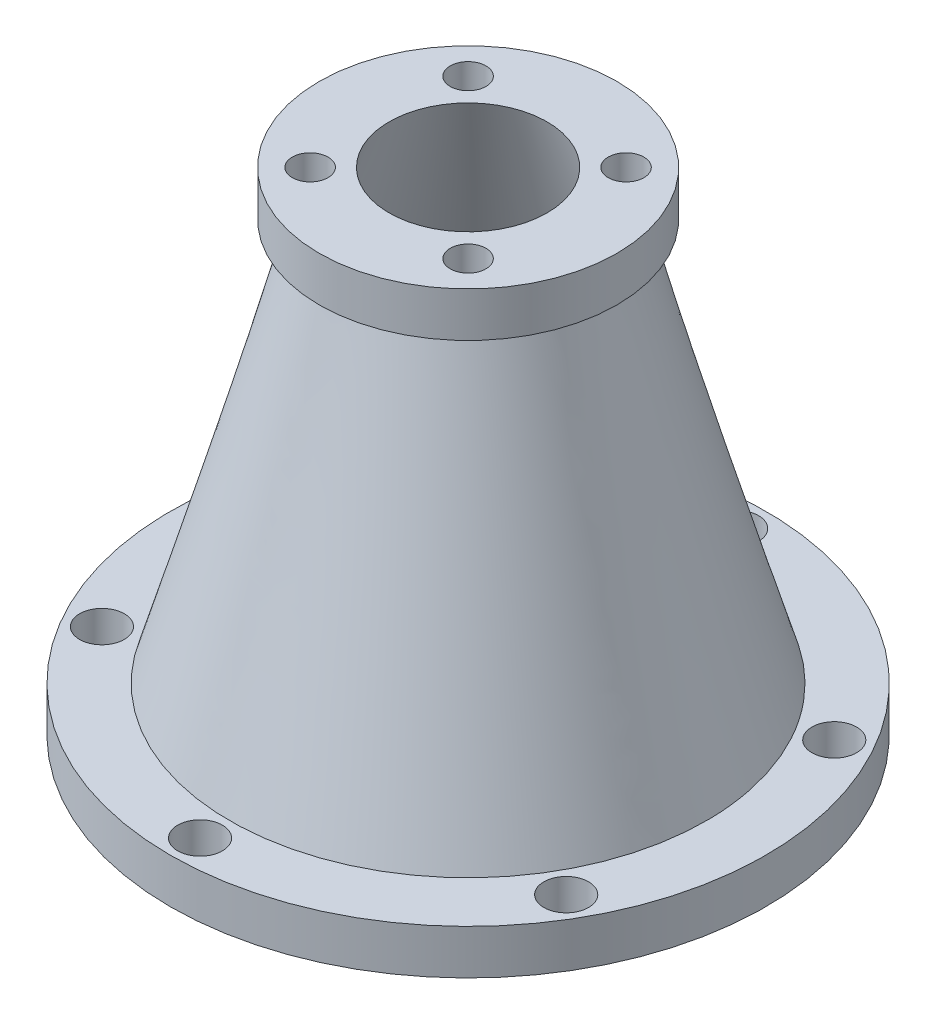
ISO-10303-21;
HEADER;
FILE_DESCRIPTION(('STEP AP214'),'2;1');
FILE_NAME('part.step','',(''),(''),'','','');
FILE_SCHEMA(('AUTOMOTIVE_DESIGN { 1 0 10303 214 1 1 1 1 }'));
ENDSEC;
DATA;
#1=APPLICATION_CONTEXT('core data for automotive mechanical design processes');
#2=APPLICATION_PROTOCOL_DEFINITION('international standard','automotive_design',2000,#1);
#3=PRODUCT_CONTEXT('',#1,'mechanical');
#4=PRODUCT('Part','Part','',(#3));
#5=PRODUCT_RELATED_PRODUCT_CATEGORY('part','',(#4));
#6=PRODUCT_DEFINITION_FORMATION('','',#4);
#7=PRODUCT_DEFINITION_CONTEXT('part definition',#1,'design');
#8=PRODUCT_DEFINITION('design','',#6,#7);
#9=PRODUCT_DEFINITION_SHAPE('','',#8);
#10=(LENGTH_UNIT() NAMED_UNIT(*) SI_UNIT(.MILLI.,.METRE.));
#11=(NAMED_UNIT(*) PLANE_ANGLE_UNIT() SI_UNIT($,.RADIAN.));
#12=(NAMED_UNIT(*) SI_UNIT($,.STERADIAN.) SOLID_ANGLE_UNIT());
#13=UNCERTAINTY_MEASURE_WITH_UNIT(LENGTH_MEASURE(1.E-05),#10,'distance_accuracy_value','');
#14=(GEOMETRIC_REPRESENTATION_CONTEXT(3) GLOBAL_UNCERTAINTY_ASSIGNED_CONTEXT((#13)) GLOBAL_UNIT_ASSIGNED_CONTEXT((#10,
#11,#12)) REPRESENTATION_CONTEXT('',''));
#15=CARTESIAN_POINT('',(0.,0.,0.));
#16=DIRECTION('',(0.,0.,1.));
#17=DIRECTION('',(1.,0.,0.));
#18=AXIS2_PLACEMENT_3D('',#15,#16,#17);
#19=CARTESIAN_POINT('',(0.,30.,0.));
#20=DIRECTION('',(0.,1.,0.));
#21=DIRECTION('',(0.,0.,1.));
#22=AXIS2_PLACEMENT_3D('',#19,#20,#21);
#23=PLANE('',#22);
#24=CARTESIAN_POINT('',(0.,30.,-180.));
#25=DIRECTION('',(0.,1.,0.));
#26=DIRECTION('',(0.,0.,1.));
#27=AXIS2_PLACEMENT_3D('',#24,#25,#26);
#28=CIRCLE('',#27,15.);
#29=CARTESIAN_POINT('',(0.,30.,-165.));
#30=VERTEX_POINT('',#29);
#31=EDGE_CURVE('E72',#30,#30,#28,.T.);
#32=ORIENTED_EDGE('',*,*,#31,.F.);
#33=EDGE_LOOP('',(#32));
#34=FACE_BOUND('',#33,.T.);
#35=CARTESIAN_POINT('',(-155.884572681198,30.,-90.0000000000018));
#36=DIRECTION('',(0.,1.,0.));
#37=DIRECTION('',(0.,0.,1.));
#38=AXIS2_PLACEMENT_3D('',#35,#36,#37);
#39=CIRCLE('',#38,15.);
#40=CARTESIAN_POINT('',(-155.884572681198,30.,-75.0000000000018));
#41=VERTEX_POINT('',#40);
#42=EDGE_CURVE('E168',#41,#41,#39,.T.);
#43=ORIENTED_EDGE('',*,*,#42,.F.);
#44=EDGE_LOOP('',(#43));
#45=FACE_BOUND('',#44,.T.);
#46=CARTESIAN_POINT('',(-155.8845726812,30.,89.9999999999985));
#47=DIRECTION('',(0.,1.,0.));
#48=DIRECTION('',(0.,0.,1.));
#49=AXIS2_PLACEMENT_3D('',#46,#47,#48);
#50=CIRCLE('',#49,15.);
#51=CARTESIAN_POINT('',(-155.8845726812,30.,104.999999999999));
#52=VERTEX_POINT('',#51);
#53=EDGE_CURVE('E172',#52,#52,#50,.T.);
#54=ORIENTED_EDGE('',*,*,#53,.F.);
#55=EDGE_LOOP('',(#54));
#56=FACE_BOUND('',#55,.T.);
#57=CARTESIAN_POINT('',(-1.25693328198353E-12,30.,180.));
#58=DIRECTION('',(0.,1.,0.));
#59=DIRECTION('',(0.,0.,1.));
#60=AXIS2_PLACEMENT_3D('',#57,#58,#59);
#61=CIRCLE('',#60,15.);
#62=CARTESIAN_POINT('',(-1.25693328198353E-12,30.,195.));
#63=VERTEX_POINT('',#62);
#64=EDGE_CURVE('E176',#63,#63,#61,.T.);
#65=ORIENTED_EDGE('',*,*,#64,.F.);
#66=EDGE_LOOP('',(#65));
#67=FACE_BOUND('',#66,.T.);
#68=CARTESIAN_POINT('',(155.884572681199,30.,90.0000000000007));
#69=DIRECTION('',(0.,1.,0.));
#70=DIRECTION('',(0.,0.,1.));
#71=AXIS2_PLACEMENT_3D('',#68,#69,#70);
#72=CIRCLE('',#71,15.);
#73=CARTESIAN_POINT('',(155.884572681199,30.,105.000000000001));
#74=VERTEX_POINT('',#73);
#75=EDGE_CURVE('E180',#74,#74,#72,.T.);
#76=ORIENTED_EDGE('',*,*,#75,.F.);
#77=EDGE_LOOP('',(#76));
#78=FACE_BOUND('',#77,.T.);
#79=CARTESIAN_POINT('',(155.884572681199,30.,-89.9999999999996));
#80=DIRECTION('',(0.,1.,0.));
#81=DIRECTION('',(0.,0.,1.));
#82=AXIS2_PLACEMENT_3D('',#79,#80,#81);
#83=CIRCLE('',#82,15.);
#84=CARTESIAN_POINT('',(155.884572681199,30.,-74.9999999999996));
#85=VERTEX_POINT('',#84);
#86=EDGE_CURVE('E183',#85,#85,#83,.T.);
#87=ORIENTED_EDGE('',*,*,#86,.F.);
#88=EDGE_LOOP('',(#87));
#89=FACE_BOUND('',#88,.T.);
#90=CARTESIAN_POINT('',(0.,30.,0.));
#91=DIRECTION('',(0.,1.,0.));
#92=DIRECTION('',(0.,0.,1.));
#93=AXIS2_PLACEMENT_3D('',#90,#91,#92);
#94=CIRCLE('',#93,200.);
#95=CARTESIAN_POINT('',(0.,30.,200.));
#96=VERTEX_POINT('',#95);
#97=EDGE_CURVE('E11',#96,#96,#94,.T.);
#98=ORIENTED_EDGE('',*,*,#97,.T.);
#99=EDGE_LOOP('',(#98));
#100=FACE_BOUND('',#99,.T.);
#101=CARTESIAN_POINT('',(0.,30.,0.));
#102=DIRECTION('',(0.,1.,0.));
#103=DIRECTION('',(0.,0.,1.));
#104=AXIS2_PLACEMENT_3D('',#101,#102,#103);
#105=CIRCLE('',#104,160.);
#106=CARTESIAN_POINT('',(-150.093208599361,30.,55.4258850389299));
#107=VERTEX_POINT('',#106);
#108=EDGE_CURVE('E127',#107,#107,#105,.T.);
#109=ORIENTED_EDGE('',*,*,#108,.F.);
#110=EDGE_LOOP('',(#109));
#111=FACE_BOUND('',#110,.T.);
#112=ADVANCED_FACE('F47',(#34,#45,#56,#67,#78,#89,#100,#111),#23,.T.);
#113=CARTESIAN_POINT('',(0.,30.,0.));
#114=DIRECTION('',(0.,-1.,0.));
#115=DIRECTION('',(0.,0.,-1.));
#116=AXIS2_PLACEMENT_3D('',#113,#114,#115);
#117=CYLINDRICAL_SURFACE('',#116,200.);
#118=ORIENTED_EDGE('',*,*,#97,.F.);
#119=EDGE_LOOP('',(#118));
#120=FACE_BOUND('',#119,.T.);
#121=CARTESIAN_POINT('',(0.,0.,0.));
#122=DIRECTION('',(0.,1.,0.));
#123=DIRECTION('',(0.,0.,1.));
#124=AXIS2_PLACEMENT_3D('',#121,#122,#123);
#125=CIRCLE('',#124,200.);
#126=CARTESIAN_POINT('',(0.,0.,200.));
#127=VERTEX_POINT('',#126);
#128=EDGE_CURVE('E56',#127,#127,#125,.T.);
#129=ORIENTED_EDGE('',*,*,#128,.T.);
#130=EDGE_LOOP('',(#129));
#131=FACE_BOUND('',#130,.T.);
#132=ADVANCED_FACE('F49',(#120,#131),#117,.T.);
#133=CARTESIAN_POINT('',(0.,0.,0.));
#134=DIRECTION('',(0.,1.,0.));
#135=DIRECTION('',(0.,0.,1.));
#136=AXIS2_PLACEMENT_3D('',#133,#134,#135);
#137=PLANE('',#136);
#138=CARTESIAN_POINT('',(0.,0.,-180.));
#139=DIRECTION('',(0.,1.,0.));
#140=DIRECTION('',(0.,0.,1.));
#141=AXIS2_PLACEMENT_3D('',#138,#139,#140);
#142=CIRCLE('',#141,15.);
#143=CARTESIAN_POINT('',(0.,0.,-165.));
#144=VERTEX_POINT('',#143);
#145=EDGE_CURVE('E51',#144,#144,#142,.T.);
#146=ORIENTED_EDGE('',*,*,#145,.T.);
#147=EDGE_LOOP('',(#146));
#148=FACE_BOUND('',#147,.T.);
#149=CARTESIAN_POINT('',(-155.884572681198,0.,-90.0000000000018));
#150=DIRECTION('',(0.,1.,0.));
#151=DIRECTION('',(0.,0.,1.));
#152=AXIS2_PLACEMENT_3D('',#149,#150,#151);
#153=CIRCLE('',#152,15.);
#154=CARTESIAN_POINT('',(-155.884572681198,0.,-75.0000000000018));
#155=VERTEX_POINT('',#154);
#156=EDGE_CURVE('E83',#155,#155,#153,.T.);
#157=ORIENTED_EDGE('',*,*,#156,.T.);
#158=EDGE_LOOP('',(#157));
#159=FACE_BOUND('',#158,.T.);
#160=CARTESIAN_POINT('',(-155.8845726812,0.,89.9999999999985));
#161=DIRECTION('',(0.,1.,0.));
#162=DIRECTION('',(0.,0.,1.));
#163=AXIS2_PLACEMENT_3D('',#160,#161,#162);
#164=CIRCLE('',#163,15.);
#165=CARTESIAN_POINT('',(-155.8845726812,0.,104.999999999999));
#166=VERTEX_POINT('',#165);
#167=EDGE_CURVE('E80',#166,#166,#164,.T.);
#168=ORIENTED_EDGE('',*,*,#167,.T.);
#169=EDGE_LOOP('',(#168));
#170=FACE_BOUND('',#169,.T.);
#171=CARTESIAN_POINT('',(-1.25693328198353E-12,0.,180.));
#172=DIRECTION('',(0.,1.,0.));
#173=DIRECTION('',(0.,0.,1.));
#174=AXIS2_PLACEMENT_3D('',#171,#172,#173);
#175=CIRCLE('',#174,15.);
#176=CARTESIAN_POINT('',(-1.25693328198353E-12,0.,195.));
#177=VERTEX_POINT('',#176);
#178=EDGE_CURVE('E76',#177,#177,#175,.T.);
#179=ORIENTED_EDGE('',*,*,#178,.T.);
#180=EDGE_LOOP('',(#179));
#181=FACE_BOUND('',#180,.T.);
#182=CARTESIAN_POINT('',(155.884572681199,0.,90.0000000000007));
#183=DIRECTION('',(0.,1.,0.));
#184=DIRECTION('',(0.,0.,1.));
#185=AXIS2_PLACEMENT_3D('',#182,#183,#184);
#186=CIRCLE('',#185,15.);
#187=CARTESIAN_POINT('',(155.884572681199,0.,105.000000000001));
#188=VERTEX_POINT('',#187);
#189=EDGE_CURVE('E71',#188,#188,#186,.T.);
#190=ORIENTED_EDGE('',*,*,#189,.T.);
#191=EDGE_LOOP('',(#190));
#192=FACE_BOUND('',#191,.T.);
#193=CARTESIAN_POINT('',(155.884572681199,0.,-89.9999999999996));
#194=DIRECTION('',(0.,1.,0.));
#195=DIRECTION('',(0.,0.,1.));
#196=AXIS2_PLACEMENT_3D('',#193,#194,#195);
#197=CIRCLE('',#196,15.);
#198=CARTESIAN_POINT('',(155.884572681199,0.,-74.9999999999996));
#199=VERTEX_POINT('',#198);
#200=EDGE_CURVE('E67',#199,#199,#197,.T.);
#201=ORIENTED_EDGE('',*,*,#200,.T.);
#202=EDGE_LOOP('',(#201));
#203=FACE_BOUND('',#202,.T.);
#204=CARTESIAN_POINT('',(0.,-7.13234185516767E-13,0.));
#205=DIRECTION('',(0.,-1.,0.));
#206=DIRECTION('',(1.,0.,0.));
#207=AXIS2_PLACEMENT_3D('',#204,#205,#206);
#208=CIRCLE('',#207,160.);
#209=CARTESIAN_POINT('',(160.,-1.38777878078145E-12,0.));
#210=VERTEX_POINT('',#209);
#211=EDGE_CURVE('E109',#210,#210,#208,.T.);
#212=ORIENTED_EDGE('',*,*,#211,.F.);
#213=EDGE_LOOP('',(#212));
#214=FACE_BOUND('',#213,.T.);
#215=ORIENTED_EDGE('',*,*,#128,.F.);
#216=EDGE_LOOP('',(#215));
#217=FACE_BOUND('',#216,.T.);
#218=ADVANCED_FACE('F142',(#148,#159,#170,#181,#192,#203,#214,#217),#137,.F.);
#219=CARTESIAN_POINT('',(-150.093208599361,30.,55.4258850389299));
#220=CARTESIAN_POINT('',(-84.9757732460578,300.,2.02927603705476));
#221=CARTESIAN_POINT('',(-39.2414385215012,30.,355.612302237652));
#222=CARTESIAN_POINT('',(-80.9172211719483,300.,171.98082252917));
#223=CARTESIAN_POINT('',(260.944978677221,30.,244.760532159792));
#224=CARTESIAN_POINT('',(89.0343253201674,300.,167.922270455061));
#225=CARTESIAN_POINT('',(150.093208599361,30.,-55.4258850389301));
#226=CARTESIAN_POINT('',(84.9757732460578,300.,-2.02927603705477));
#227=CARTESIAN_POINT('',(39.241438521501,30.,-355.612302237652));
#228=CARTESIAN_POINT('',(80.9172211719483,300.,-171.98082252917));
#229=CARTESIAN_POINT('',(-260.944978677221,30.,-244.760532159792));
#230=CARTESIAN_POINT('',(-89.0343253201674,300.,-167.922270455061));
#231=CARTESIAN_POINT('',(-150.093208599361,30.,55.4258850389299));
#232=CARTESIAN_POINT('',(-84.9757732460578,300.,2.02927603705476));
#233=(BOUNDED_SURFACE() B_SPLINE_SURFACE(3,1,((#219,#220),(#221,#222),(#223,#224),(#225,#226),
(#227,#228),(#229,#230),(#231,#232)),.UNSPECIFIED.,.T.,.F.,.F.) B_SPLINE_SURFACE_WITH_KNOTS((4,
3,4),(2,2),(0.,0.5,1.),(0.,1.),
.UNSPECIFIED.) GEOMETRIC_REPRESENTATION_ITEM() RATIONAL_B_SPLINE_SURFACE(((1.,1.),
(0.333333333333333,0.333333333333333),(0.333333333333333,0.333333333333333),(1.,1.),
(0.333333333333333,0.333333333333333),(0.333333333333333,0.333333333333333),(1.,1.))) REPRESENTATION_ITEM('') SURFACE());
#234=CARTESIAN_POINT('',(0.,300.,0.));
#235=DIRECTION('',(0.,1.,0.));
#236=DIRECTION('',(0.,0.,1.));
#237=AXIS2_PLACEMENT_3D('',#234,#235,#236);
#238=CIRCLE('',#237,85.);
#239=CARTESIAN_POINT('',(-84.9757732460578,300.,2.02927603705476));
#240=VERTEX_POINT('',#239);
#241=EDGE_CURVE('E62',#240,#240,#238,.T.);
#242=CARTESIAN_POINT('',(-150.093208599361,30.,55.4258850389299));
#243=CARTESIAN_POINT('',(-149.414901981098,32.8125,54.869670361827));
#244=CARTESIAN_POINT('',(-148.736595362834,35.625,54.3134556847242));
#245=CARTESIAN_POINT('',(-147.379982126307,41.25,53.2010263305184));
#246=CARTESIAN_POINT('',(-146.701675508043,44.0625,52.6448116534156));
#247=CARTESIAN_POINT('',(-145.345062271516,49.6875,51.5323822992098));
#248=CARTESIAN_POINT('',(-144.666755653252,52.5,50.976167622107));
#249=CARTESIAN_POINT('',(-143.310142416725,58.125,49.8637382679012));
#250=CARTESIAN_POINT('',(-142.631835798462,60.9375,49.3075235907984));
#251=CARTESIAN_POINT('',(-141.275222561935,66.5625,48.1950942365927));
#252=CARTESIAN_POINT('',(-140.596915943671,69.375,47.6388795594898));
#253=CARTESIAN_POINT('',(-139.240302707144,75.,46.5264502052841));
#254=CARTESIAN_POINT('',(-138.56199608888,77.8125,45.9702355281812));
#255=CARTESIAN_POINT('',(-137.205382852353,83.4375,44.8578061739755));
#256=CARTESIAN_POINT('',(-136.52707623409,86.25,44.3015914968726));
#257=CARTESIAN_POINT('',(-135.170462997562,91.875,43.1891621426669));
#258=CARTESIAN_POINT('',(-134.492156379299,94.6875,42.632947465564));
#259=CARTESIAN_POINT('',(-133.135543142772,100.3125,41.5205181113583));
#260=CARTESIAN_POINT('',(-132.457236524508,103.125,40.9643034342554));
#261=CARTESIAN_POINT('',(-131.100623287981,108.75,39.8518740800497));
#262=CARTESIAN_POINT('',(-130.422316669717,111.5625,39.2956594029468));
#263=CARTESIAN_POINT('',(-129.06570343319,117.1875,38.1832300487411));
#264=CARTESIAN_POINT('',(-128.387396814927,120.,37.6270153716382));
#265=CARTESIAN_POINT('',(-127.0307835784,125.625,36.5145860174325));
#266=CARTESIAN_POINT('',(-126.352476960136,128.4375,35.9583713403296));
#267=CARTESIAN_POINT('',(-124.995863723609,134.0625,34.8459419861239));
#268=CARTESIAN_POINT('',(-124.317557105345,136.875,34.289727309021));
#269=CARTESIAN_POINT('',(-122.960943868818,142.5,33.1772979548153));
#270=CARTESIAN_POINT('',(-122.282637250555,145.3125,32.6210832777124));
#271=CARTESIAN_POINT('',(-120.926024014027,150.9375,31.5086539235067));
#272=CARTESIAN_POINT('',(-120.247717395764,153.75,30.9524392464038));
#273=CARTESIAN_POINT('',(-118.891104159237,159.375,29.8400098921981));
#274=CARTESIAN_POINT('',(-118.212797540973,162.1875,29.2837952150952));
#275=CARTESIAN_POINT('',(-116.856184304446,167.8125,28.1713658608895));
#276=CARTESIAN_POINT('',(-116.177877686182,170.625,27.6151511837866));
#277=CARTESIAN_POINT('',(-114.821264449655,176.25,26.5027218295809));
#278=CARTESIAN_POINT('',(-114.142957831392,179.0625,25.946507152478));
#279=CARTESIAN_POINT('',(-112.786344594864,184.6875,24.8340777982723));
#280=CARTESIAN_POINT('',(-112.108037976601,187.5,24.2778631211694));
#281=CARTESIAN_POINT('',(-110.751424740074,193.125,23.1654337669637));
#282=CARTESIAN_POINT('',(-110.07311812181,195.9375,22.6092190898608));
#283=CARTESIAN_POINT('',(-108.716504885283,201.5625,21.4967897356551));
#284=CARTESIAN_POINT('',(-108.038198267019,204.375,20.9405750585522));
#285=CARTESIAN_POINT('',(-106.681585030492,210.,19.8281457043465));
#286=CARTESIAN_POINT('',(-106.003278412229,212.8125,19.2719310272436));
#287=CARTESIAN_POINT('',(-104.646665175702,218.4375,18.1595016730379));
#288=CARTESIAN_POINT('',(-103.968358557438,221.25,17.603286995935));
#289=CARTESIAN_POINT('',(-102.611745320911,226.875,16.4908576417293));
#290=CARTESIAN_POINT('',(-101.933438702647,229.6875,15.9346429646264));
#291=CARTESIAN_POINT('',(-100.57682546612,235.3125,14.8222136104207));
#292=CARTESIAN_POINT('',(-99.8985188478565,238.125,14.2659989333178));
#293=CARTESIAN_POINT('',(-98.5419056113293,243.75,13.1535695791121));
#294=CARTESIAN_POINT('',(-97.8635989930658,246.5625,12.5973549020092));
#295=CARTESIAN_POINT('',(-96.5069857565386,252.1875,11.4849255478035));
#296=CARTESIAN_POINT('',(-95.828679138275,255.,10.9287108707006));
#297=CARTESIAN_POINT('',(-94.4720659017479,260.625,9.81628151649489));
#298=CARTESIAN_POINT('',(-93.7937592834843,263.4375,9.26006683939202));
#299=CARTESIAN_POINT('',(-92.4371460469572,269.0625,8.14763748518629));
#300=CARTESIAN_POINT('',(-91.7588394286936,271.875,7.59142280808342));
#301=CARTESIAN_POINT('',(-90.4022261921664,277.5,6.47899345387769));
#302=CARTESIAN_POINT('',(-89.7239195739029,280.3125,5.92277877677483));
#303=CARTESIAN_POINT('',(-88.3673063373757,285.9375,4.8103494225691));
#304=CARTESIAN_POINT('',(-87.6889997191121,288.75,4.25413474546623));
#305=CARTESIAN_POINT('',(-86.332386482585,294.375,3.14170539126049));
#306=CARTESIAN_POINT('',(-85.6540798643214,297.1875,2.58549071415762));
#307=CARTESIAN_POINT('',(-84.9757732460578,300.,2.02927603705476));
#308=B_SPLINE_CURVE_WITH_KNOTS('',3,(#242,#243,#244,#245,#246,#247,#248,#249,#250,#251,#252,
#253,#254,#255,#256,#257,#258,#259,#260,#261,#262,#263,#264,#265,#266,#267,#268,#269,#270,#271,
#272,#273,#274,#275,#276,#277,#278,#279,#280,#281,#282,#283,#284,#285,#286,#287,#288,#289,#290,
#291,#292,#293,#294,#295,#296,#297,#298,#299,#300,#301,#302,#303,#304,#305,#306,#307),
.UNSPECIFIED.,.F.,.F.,(4,2,2,2,2,2,2,2,2,2,2,2,2,2,2,2,2,2,2,2,2,2,2,2,2,2,2,2,2,2,2,2,4),(0.,
8.83836398711002,17.67672797422,26.5150919613301,35.3534559484401,44.1918199355501,
53.0301839226601,61.8685479097701,70.7069118968802,79.5452758839902,88.3836398711002,
97.2220038582102,106.06036784532,114.89873183243,123.73709581954,132.57545980665,
141.41382379376,150.25218778087,159.09055176798,167.92891575509,176.7672797422,185.60564372931,
194.44400771642,203.28237170353,212.12073569064,220.959099677751,229.797463664861,
238.635827651971,247.474191639081,256.312555626191,265.150919613301,273.989283600411,
282.827647587521),.UNSPECIFIED.);
#309=EDGE_CURVE('BSEAM140',#107,#240,#308,.T.);
#310=ORIENTED_EDGE('',*,*,#108,.T.);
#311=ORIENTED_EDGE('',*,*,#241,.F.);
#312=ORIENTED_EDGE('',*,*,#309,.T.);
#313=ORIENTED_EDGE('',*,*,#309,.F.);
#314=EDGE_LOOP('',(#310,#312,#311,#313));
#315=FACE_BOUND('',#314,.T.);
#316=ADVANCED_FACE('F140',(#315),#233,.T.);
#317=CARTESIAN_POINT('',(0.,300.,0.));
#318=DIRECTION('',(0.,1.,0.));
#319=DIRECTION('',(0.,0.,1.));
#320=AXIS2_PLACEMENT_3D('',#317,#318,#319);
#321=PLANE('',#320);
#322=CARTESIAN_POINT('',(0.,300.,0.));
#323=DIRECTION('',(0.,1.,0.));
#324=DIRECTION('',(0.,0.,1.));
#325=AXIS2_PLACEMENT_3D('',#322,#323,#324);
#326=CIRCLE('',#325,100.);
#327=CARTESIAN_POINT('',(0.,300.,100.));
#328=VERTEX_POINT('',#327);
#329=EDGE_CURVE('E122',#328,#328,#326,.T.);
#330=ORIENTED_EDGE('',*,*,#329,.F.);
#331=EDGE_LOOP('',(#330));
#332=FACE_BOUND('',#331,.T.);
#333=ORIENTED_EDGE('',*,*,#241,.T.);
#334=EDGE_LOOP('',(#333));
#335=FACE_BOUND('',#334,.T.);
#336=ADVANCED_FACE('F138',(#332,#335),#321,.F.);
#337=CARTESIAN_POINT('',(0.,330.,0.));
#338=DIRECTION('',(0.,-1.,0.));
#339=DIRECTION('',(0.,0.,-1.));
#340=AXIS2_PLACEMENT_3D('',#337,#338,#339);
#341=CYLINDRICAL_SURFACE('',#340,100.);
#342=CARTESIAN_POINT('',(0.,330.,0.));
#343=DIRECTION('',(0.,1.,0.));
#344=DIRECTION('',(0.,0.,1.));
#345=AXIS2_PLACEMENT_3D('',#342,#343,#344);
#346=CIRCLE('',#345,100.);
#347=CARTESIAN_POINT('',(0.,330.,100.));
#348=VERTEX_POINT('',#347);
#349=EDGE_CURVE('E123',#348,#348,#346,.T.);
#350=ORIENTED_EDGE('',*,*,#349,.F.);
#351=EDGE_LOOP('',(#350));
#352=FACE_BOUND('',#351,.T.);
#353=ORIENTED_EDGE('',*,*,#329,.T.);
#354=EDGE_LOOP('',(#353));
#355=FACE_BOUND('',#354,.T.);
#356=ADVANCED_FACE('F148',(#352,#355),#341,.T.);
#357=CARTESIAN_POINT('',(0.,330.,0.));
#358=DIRECTION('',(0.,1.,0.));
#359=DIRECTION('',(0.,0.,1.));
#360=AXIS2_PLACEMENT_3D('',#357,#358,#359);
#361=PLANE('',#360);
#362=CARTESIAN_POINT('',(-53.0330085889906,330.,-53.0330085889915));
#363=DIRECTION('',(0.,1.,0.));
#364=DIRECTION('',(0.,0.,1.));
#365=AXIS2_PLACEMENT_3D('',#362,#363,#364);
#366=CIRCLE('',#365,12.);
#367=CARTESIAN_POINT('',(-53.0330085889906,330.,-41.0330085889915));
#368=VERTEX_POINT('',#367);
#369=EDGE_CURVE('E95',#368,#368,#366,.T.);
#370=ORIENTED_EDGE('',*,*,#369,.F.);
#371=EDGE_LOOP('',(#370));
#372=FACE_BOUND('',#371,.T.);
#373=CARTESIAN_POINT('',(-53.0330085889913,330.,53.0330085889908));
#374=DIRECTION('',(0.,1.,0.));
#375=DIRECTION('',(0.,0.,1.));
#376=AXIS2_PLACEMENT_3D('',#373,#374,#375);
#377=CIRCLE('',#376,12.);
#378=CARTESIAN_POINT('',(-53.0330085889913,330.,65.0330085889908));
#379=VERTEX_POINT('',#378);
#380=EDGE_CURVE('E205',#379,#379,#377,.T.);
#381=ORIENTED_EDGE('',*,*,#380,.F.);
#382=EDGE_LOOP('',(#381));
#383=FACE_BOUND('',#382,.T.);
#384=CARTESIAN_POINT('',(53.033008588991,330.,53.0330085889912));
#385=DIRECTION('',(0.,1.,0.));
#386=DIRECTION('',(0.,0.,1.));
#387=AXIS2_PLACEMENT_3D('',#384,#385,#386);
#388=CIRCLE('',#387,12.);
#389=CARTESIAN_POINT('',(53.033008588991,330.,65.0330085889912));
#390=VERTEX_POINT('',#389);
#391=EDGE_CURVE('E114',#390,#390,#388,.T.);
#392=ORIENTED_EDGE('',*,*,#391,.F.);
#393=EDGE_LOOP('',(#392));
#394=FACE_BOUND('',#393,.T.);
#395=CARTESIAN_POINT('',(53.033008588991,330.,-53.0330085889912));
#396=DIRECTION('',(0.,1.,0.));
#397=DIRECTION('',(0.,0.,1.));
#398=AXIS2_PLACEMENT_3D('',#395,#396,#397);
#399=CIRCLE('',#398,12.);
#400=CARTESIAN_POINT('',(53.033008588991,330.,-41.0330085889912));
#401=VERTEX_POINT('',#400);
#402=EDGE_CURVE('E110',#401,#401,#399,.T.);
#403=ORIENTED_EDGE('',*,*,#402,.F.);
#404=EDGE_LOOP('',(#403));
#405=FACE_BOUND('',#404,.T.);
#406=CARTESIAN_POINT('',(1.47104550762833E-12,330.,0.));
#407=DIRECTION('',(0.,-1.,0.));
#408=DIRECTION('',(1.,0.,0.));
#409=AXIS2_PLACEMENT_3D('',#406,#407,#408);
#410=CIRCLE('',#409,53.0330085889928);
#411=CARTESIAN_POINT('',(53.0330085889943,329.999999999999,0.));
#412=VERTEX_POINT('',#411);
#413=EDGE_CURVE('E118',#412,#412,#410,.T.);
#414=ORIENTED_EDGE('',*,*,#413,.T.);
#415=EDGE_LOOP('',(#414));
#416=FACE_BOUND('',#415,.T.);
#417=ORIENTED_EDGE('',*,*,#349,.T.);
#418=EDGE_LOOP('',(#417));
#419=FACE_BOUND('',#418,.T.);
#420=ADVANCED_FACE('F221',(#372,#383,#394,#405,#416,#419),#361,.T.);
#421=CARTESIAN_POINT('',(1.47104550762833E-12,330.,0.));
#422=DIRECTION('',(0.,-1.,0.));
#423=DIRECTION('',(1.,0.,0.));
#424=AXIS2_PLACEMENT_3D('',#421,#422,#423);
#425=CONICAL_SURFACE('',#424,53.0330085889928,0.313456032164884);
#426=CARTESIAN_POINT('',(160.,-1.38777878078145E-12,0.));
#427=CARTESIAN_POINT('',(158.885760506135,3.43749999999862,0.));
#428=CARTESIAN_POINT('',(157.771521012271,6.87499999999862,0.));
#429=CARTESIAN_POINT('',(155.543042024541,13.7499999999986,0.));
#430=CARTESIAN_POINT('',(154.428802530677,17.1874999999987,0.));
#431=CARTESIAN_POINT('',(152.200323542948,24.0624999999987,0.));
#432=CARTESIAN_POINT('',(151.086084049083,27.4999999999987,0.));
#433=CARTESIAN_POINT('',(148.857605061354,34.3749999999987,0.));
#434=CARTESIAN_POINT('',(147.743365567489,37.8124999999987,0.));
#435=CARTESIAN_POINT('',(145.51488657976,44.6874999999987,0.));
#436=CARTESIAN_POINT('',(144.400647085895,48.1249999999987,0.));
#437=CARTESIAN_POINT('',(142.172168098166,54.9999999999987,0.));
#438=CARTESIAN_POINT('',(141.057928604301,58.4374999999988,0.));
#439=CARTESIAN_POINT('',(138.829449616572,65.3124999999988,0.));
#440=CARTESIAN_POINT('',(137.715210122707,68.7499999999988,0.));
#441=CARTESIAN_POINT('',(135.486731134978,75.6249999999988,0.));
#442=CARTESIAN_POINT('',(134.372491641113,79.0624999999988,0.));
#443=CARTESIAN_POINT('',(132.144012653384,85.9374999999988,0.));
#444=CARTESIAN_POINT('',(131.029773159519,89.3749999999989,0.));
#445=CARTESIAN_POINT('',(128.80129417179,96.2499999999989,0.));
#446=CARTESIAN_POINT('',(127.687054677925,99.6874999999989,0.));
#447=CARTESIAN_POINT('',(125.458575690196,106.562499999999,0.));
#448=CARTESIAN_POINT('',(124.344336196331,109.999999999999,0.));
#449=CARTESIAN_POINT('',(122.115857208602,116.874999999999,0.));
#450=CARTESIAN_POINT('',(121.001617714737,120.312499999999,0.));
#451=CARTESIAN_POINT('',(118.773138727008,127.187499999999,0.));
#452=CARTESIAN_POINT('',(117.658899233144,130.624999999999,0.));
#453=CARTESIAN_POINT('',(115.430420245414,137.499999999999,0.));
#454=CARTESIAN_POINT('',(114.31618075155,140.937499999999,0.));
#455=CARTESIAN_POINT('',(112.08770176382,147.812499999999,0.));
#456=CARTESIAN_POINT('',(110.973462269956,151.249999999999,0.));
#457=CARTESIAN_POINT('',(108.744983282226,158.124999999999,0.));
#458=CARTESIAN_POINT('',(107.630743788362,161.562499999999,0.));
#459=CARTESIAN_POINT('',(105.402264800632,168.437499999999,0.));
#460=CARTESIAN_POINT('',(104.288025306768,171.874999999999,0.));
#461=CARTESIAN_POINT('',(102.059546319039,178.749999999999,0.));
#462=CARTESIAN_POINT('',(100.945306825174,182.187499999999,0.));
#463=CARTESIAN_POINT('',(98.7168278374447,189.062499999999,0.));
#464=CARTESIAN_POINT('',(97.60258834358,192.499999999999,0.));
#465=CARTESIAN_POINT('',(95.3741093558507,199.374999999999,0.));
#466=CARTESIAN_POINT('',(94.2598698619861,202.812499999999,0.));
#467=CARTESIAN_POINT('',(92.0313908742568,209.687499999999,0.));
#468=CARTESIAN_POINT('',(90.9171513803921,213.124999999999,0.));
#469=CARTESIAN_POINT('',(88.6886723926629,219.999999999999,0.));
#470=CARTESIAN_POINT('',(87.5744328987982,223.437499999999,0.));
#471=CARTESIAN_POINT('',(85.3459539110689,230.312499999999,0.));
#472=CARTESIAN_POINT('',(84.2317144172043,233.749999999999,0.));
#473=CARTESIAN_POINT('',(82.003235429475,240.624999999999,0.));
#474=CARTESIAN_POINT('',(80.8889959356104,244.062499999999,0.));
#475=CARTESIAN_POINT('',(78.6605169478811,250.937499999999,0.));
#476=CARTESIAN_POINT('',(77.5462774540164,254.374999999999,0.));
#477=CARTESIAN_POINT('',(75.3177984662872,261.249999999999,0.));
#478=CARTESIAN_POINT('',(74.2035589724225,264.687499999999,0.));
#479=CARTESIAN_POINT('',(71.9750799846932,271.562499999999,0.));
#480=CARTESIAN_POINT('',(70.8608404908286,274.999999999999,0.));
#481=CARTESIAN_POINT('',(68.6323615030993,281.874999999999,0.));
#482=CARTESIAN_POINT('',(67.5181220092347,285.312499999999,0.));
#483=CARTESIAN_POINT('',(65.2896430215054,292.187499999999,0.));
#484=CARTESIAN_POINT('',(64.1754035276407,295.624999999999,0.));
#485=CARTESIAN_POINT('',(61.9469245399114,302.499999999999,0.));
#486=CARTESIAN_POINT('',(60.8326850460468,305.937499999999,0.));
#487=CARTESIAN_POINT('',(58.6042060583175,312.812499999999,0.));
#488=CARTESIAN_POINT('',(57.4899665644529,316.249999999999,0.));
#489=CARTESIAN_POINT('',(55.2614875767236,323.124999999999,0.));
#490=CARTESIAN_POINT('',(54.1472480828589,326.562499999999,0.));
#491=CARTESIAN_POINT('',(53.0330085889943,329.999999999999,0.));
#492=B_SPLINE_CURVE_WITH_KNOTS('',3,(#426,#427,#428,#429,#430,#431,#432,#433,#434,#435,#436,
#437,#438,#439,#440,#441,#442,#443,#444,#445,#446,#447,#448,#449,#450,#451,#452,#453,#454,#455,
#456,#457,#458,#459,#460,#461,#462,#463,#464,#465,#466,#467,#468,#469,#470,#471,#472,#473,#474,
#475,#476,#477,#478,#479,#480,#481,#482,#483,#484,#485,#486,#487,#488,#489,#490,#491),
.UNSPECIFIED.,.F.,.F.,(4,2,2,2,2,2,2,2,2,2,2,2,2,2,2,2,2,2,2,2,2,2,2,2,2,2,2,2,2,2,2,2,4),(0.,
10.840729823088,21.6814596461761,32.5221894692641,43.3629192923521,54.2036491154401,
65.0443789385282,75.8851087616162,86.7258385847042,97.5665684077923,108.40729823088,
119.248028053968,130.088757877056,140.929487700144,151.770217523232,162.61094734632,
173.451677169408,184.292406992496,195.133136815585,205.973866638673,216.814596461761,
227.655326284849,238.496056107937,249.336785931025,260.177515754113,271.018245577201,
281.858975400289,292.699705223377,303.540435046465,314.381164869553,325.221894692641,
336.062624515729,346.903354338817),.UNSPECIFIED.);
#493=EDGE_CURVE('BSEAM224',#210,#412,#492,.T.);
#494=ORIENTED_EDGE('',*,*,#211,.T.);
#495=ORIENTED_EDGE('',*,*,#413,.F.);
#496=ORIENTED_EDGE('',*,*,#493,.T.);
#497=ORIENTED_EDGE('',*,*,#493,.F.);
#498=EDGE_LOOP('',(#494,#496,#495,#497));
#499=FACE_BOUND('',#498,.T.);
#500=ADVANCED_FACE('F224',(#499),#425,.F.);
#501=CARTESIAN_POINT('',(53.033008588991,305.,-53.0330085889912));
#502=DIRECTION('',(0.,1.,0.));
#503=DIRECTION('',(0.,0.,1.));
#504=AXIS2_PLACEMENT_3D('',#501,#502,#503);
#505=CYLINDRICAL_SURFACE('',#504,12.);
#506=CARTESIAN_POINT('',(53.033008588991,305.,-53.0330085889912));
#507=DIRECTION('',(0.,1.,0.));
#508=DIRECTION('',(0.,0.,1.));
#509=AXIS2_PLACEMENT_3D('',#506,#507,#508);
#510=CIRCLE('',#509,12.);
#511=CARTESIAN_POINT('',(53.033008588991,305.,-41.0330085889912));
#512=VERTEX_POINT('',#511);
#513=EDGE_CURVE('E105',#512,#512,#510,.T.);
#514=ORIENTED_EDGE('',*,*,#513,.F.);
#515=EDGE_LOOP('',(#514));
#516=FACE_BOUND('',#515,.T.);
#517=ORIENTED_EDGE('',*,*,#402,.T.);
#518=EDGE_LOOP('',(#517));
#519=FACE_BOUND('',#518,.T.);
#520=ADVANCED_FACE('F243',(#516,#519),#505,.F.);
#521=CARTESIAN_POINT('',(53.033008588991,305.,-53.0330085889912));
#522=DIRECTION('',(0.,1.,0.));
#523=DIRECTION('',(0.,0.,1.));
#524=AXIS2_PLACEMENT_3D('',#521,#522,#523);
#525=PLANE('',#524);
#526=ORIENTED_EDGE('',*,*,#513,.T.);
#527=EDGE_LOOP('',(#526));
#528=FACE_BOUND('',#527,.T.);
#529=ADVANCED_FACE('F247',(#528),#525,.T.);
#530=CARTESIAN_POINT('',(53.033008588991,305.,53.0330085889912));
#531=DIRECTION('',(0.,1.,0.));
#532=DIRECTION('',(0.,0.,1.));
#533=AXIS2_PLACEMENT_3D('',#530,#531,#532);
#534=CYLINDRICAL_SURFACE('',#533,12.);
#535=CARTESIAN_POINT('',(53.033008588991,305.,53.0330085889912));
#536=DIRECTION('',(0.,1.,0.));
#537=DIRECTION('',(0.,0.,1.));
#538=AXIS2_PLACEMENT_3D('',#535,#536,#537);
#539=CIRCLE('',#538,12.);
#540=CARTESIAN_POINT('',(53.033008588991,305.,65.0330085889912));
#541=VERTEX_POINT('',#540);
#542=EDGE_CURVE('E201',#541,#541,#539,.T.);
#543=ORIENTED_EDGE('',*,*,#542,.F.);
#544=EDGE_LOOP('',(#543));
#545=FACE_BOUND('',#544,.T.);
#546=ORIENTED_EDGE('',*,*,#391,.T.);
#547=EDGE_LOOP('',(#546));
#548=FACE_BOUND('',#547,.T.);
#549=ADVANCED_FACE('F251',(#545,#548),#534,.F.);
#550=CARTESIAN_POINT('',(53.033008588991,305.,53.0330085889912));
#551=DIRECTION('',(0.,1.,0.));
#552=DIRECTION('',(0.,0.,1.));
#553=AXIS2_PLACEMENT_3D('',#550,#551,#552);
#554=PLANE('',#553);
#555=ORIENTED_EDGE('',*,*,#542,.T.);
#556=EDGE_LOOP('',(#555));
#557=FACE_BOUND('',#556,.T.);
#558=ADVANCED_FACE('F217',(#557),#554,.T.);
#559=CARTESIAN_POINT('',(-53.0330085889913,305.,53.0330085889908));
#560=DIRECTION('',(0.,1.,0.));
#561=DIRECTION('',(0.,0.,1.));
#562=AXIS2_PLACEMENT_3D('',#559,#560,#561);
#563=CYLINDRICAL_SURFACE('',#562,12.);
#564=CARTESIAN_POINT('',(-53.0330085889913,305.,53.0330085889908));
#565=DIRECTION('',(0.,1.,0.));
#566=DIRECTION('',(0.,0.,1.));
#567=AXIS2_PLACEMENT_3D('',#564,#565,#566);
#568=CIRCLE('',#567,12.);
#569=CARTESIAN_POINT('',(-53.0330085889913,305.,65.0330085889908));
#570=VERTEX_POINT('',#569);
#571=EDGE_CURVE('E101',#570,#570,#568,.T.);
#572=ORIENTED_EDGE('',*,*,#571,.F.);
#573=EDGE_LOOP('',(#572));
#574=FACE_BOUND('',#573,.T.);
#575=ORIENTED_EDGE('',*,*,#380,.T.);
#576=EDGE_LOOP('',(#575));
#577=FACE_BOUND('',#576,.T.);
#578=ADVANCED_FACE('F214',(#574,#577),#563,.F.);
#579=CARTESIAN_POINT('',(-53.0330085889913,305.,53.0330085889908));
#580=DIRECTION('',(0.,1.,0.));
#581=DIRECTION('',(0.,0.,1.));
#582=AXIS2_PLACEMENT_3D('',#579,#580,#581);
#583=PLANE('',#582);
#584=ORIENTED_EDGE('',*,*,#571,.T.);
#585=EDGE_LOOP('',(#584));
#586=FACE_BOUND('',#585,.T.);
#587=ADVANCED_FACE('F212',(#586),#583,.T.);
#588=CARTESIAN_POINT('',(-53.0330085889906,305.,-53.0330085889915));
#589=DIRECTION('',(0.,1.,0.));
#590=DIRECTION('',(0.,0.,1.));
#591=AXIS2_PLACEMENT_3D('',#588,#589,#590);
#592=CYLINDRICAL_SURFACE('',#591,12.);
#593=CARTESIAN_POINT('',(-53.0330085889906,305.,-53.0330085889915));
#594=DIRECTION('',(0.,1.,0.));
#595=DIRECTION('',(0.,0.,1.));
#596=AXIS2_PLACEMENT_3D('',#593,#594,#595);
#597=CIRCLE('',#596,12.);
#598=CARTESIAN_POINT('',(-53.0330085889906,305.,-41.0330085889915));
#599=VERTEX_POINT('',#598);
#600=EDGE_CURVE('E90',#599,#599,#597,.T.);
#601=ORIENTED_EDGE('',*,*,#600,.F.);
#602=EDGE_LOOP('',(#601));
#603=FACE_BOUND('',#602,.T.);
#604=ORIENTED_EDGE('',*,*,#369,.T.);
#605=EDGE_LOOP('',(#604));
#606=FACE_BOUND('',#605,.T.);
#607=ADVANCED_FACE('F256',(#603,#606),#592,.F.);
#608=CARTESIAN_POINT('',(-53.0330085889906,305.,-53.0330085889915));
#609=DIRECTION('',(0.,1.,0.));
#610=DIRECTION('',(0.,0.,1.));
#611=AXIS2_PLACEMENT_3D('',#608,#609,#610);
#612=PLANE('',#611);
#613=ORIENTED_EDGE('',*,*,#600,.T.);
#614=EDGE_LOOP('',(#613));
#615=FACE_BOUND('',#614,.T.);
#616=ADVANCED_FACE('F253',(#615),#612,.T.);
#617=CARTESIAN_POINT('',(155.884572681199,-66.,-89.9999999999996));
#618=DIRECTION('',(0.,1.,0.));
#619=DIRECTION('',(0.,0.,1.));
#620=AXIS2_PLACEMENT_3D('',#617,#618,#619);
#621=CYLINDRICAL_SURFACE('',#620,15.);
#622=ORIENTED_EDGE('',*,*,#86,.T.);
#623=EDGE_LOOP('',(#622));
#624=FACE_BOUND('',#623,.T.);
#625=ORIENTED_EDGE('',*,*,#200,.F.);
#626=EDGE_LOOP('',(#625));
#627=FACE_BOUND('',#626,.T.);
#628=ADVANCED_FACE('F255',(#624,#627),#621,.F.);
#629=CARTESIAN_POINT('',(155.884572681199,-66.,90.0000000000007));
#630=DIRECTION('',(0.,1.,0.));
#631=DIRECTION('',(0.,0.,1.));
#632=AXIS2_PLACEMENT_3D('',#629,#630,#631);
#633=CYLINDRICAL_SURFACE('',#632,15.);
#634=ORIENTED_EDGE('',*,*,#75,.T.);
#635=EDGE_LOOP('',(#634));
#636=FACE_BOUND('',#635,.T.);
#637=ORIENTED_EDGE('',*,*,#189,.F.);
#638=EDGE_LOOP('',(#637));
#639=FACE_BOUND('',#638,.T.);
#640=ADVANCED_FACE('F276',(#636,#639),#633,.F.);
#641=CARTESIAN_POINT('',(-1.25693328198353E-12,-66.,180.));
#642=DIRECTION('',(0.,1.,0.));
#643=DIRECTION('',(0.,0.,1.));
#644=AXIS2_PLACEMENT_3D('',#641,#642,#643);
#645=CYLINDRICAL_SURFACE('',#644,15.);
#646=ORIENTED_EDGE('',*,*,#64,.T.);
#647=EDGE_LOOP('',(#646));
#648=FACE_BOUND('',#647,.T.);
#649=ORIENTED_EDGE('',*,*,#178,.F.);
#650=EDGE_LOOP('',(#649));
#651=FACE_BOUND('',#650,.T.);
#652=ADVANCED_FACE('F272',(#648,#651),#645,.F.);
#653=CARTESIAN_POINT('',(-155.8845726812,-66.,89.9999999999985));
#654=DIRECTION('',(0.,1.,0.));
#655=DIRECTION('',(0.,0.,1.));
#656=AXIS2_PLACEMENT_3D('',#653,#654,#655);
#657=CYLINDRICAL_SURFACE('',#656,15.);
#658=ORIENTED_EDGE('',*,*,#53,.T.);
#659=EDGE_LOOP('',(#658));
#660=FACE_BOUND('',#659,.T.);
#661=ORIENTED_EDGE('',*,*,#167,.F.);
#662=EDGE_LOOP('',(#661));
#663=FACE_BOUND('',#662,.T.);
#664=ADVANCED_FACE('F268',(#660,#663),#657,.F.);
#665=CARTESIAN_POINT('',(-155.884572681198,-66.,-90.0000000000018));
#666=DIRECTION('',(0.,1.,0.));
#667=DIRECTION('',(0.,0.,1.));
#668=AXIS2_PLACEMENT_3D('',#665,#666,#667);
#669=CYLINDRICAL_SURFACE('',#668,15.);
#670=ORIENTED_EDGE('',*,*,#42,.T.);
#671=EDGE_LOOP('',(#670));
#672=FACE_BOUND('',#671,.T.);
#673=ORIENTED_EDGE('',*,*,#156,.F.);
#674=EDGE_LOOP('',(#673));
#675=FACE_BOUND('',#674,.T.);
#676=ADVANCED_FACE('F271',(#672,#675),#669,.F.);
#677=CARTESIAN_POINT('',(0.,-66.,-180.));
#678=DIRECTION('',(0.,1.,0.));
#679=DIRECTION('',(0.,0.,1.));
#680=AXIS2_PLACEMENT_3D('',#677,#678,#679);
#681=CYLINDRICAL_SURFACE('',#680,15.);
#682=ORIENTED_EDGE('',*,*,#31,.T.);
#683=EDGE_LOOP('',(#682));
#684=FACE_BOUND('',#683,.T.);
#685=ORIENTED_EDGE('',*,*,#145,.F.);
#686=EDGE_LOOP('',(#685));
#687=FACE_BOUND('',#686,.T.);
#688=ADVANCED_FACE('F285',(#684,#687),#681,.F.);
#689=CLOSED_SHELL('',(#112,#132,#218,#316,#336,#356,#420,#500,#520,#529,#549,#558,#578,#587,
#607,#616,#628,#640,#652,#664,#676,#688));
#690=MANIFOLD_SOLID_BREP('B2',#689);
#691=ADVANCED_BREP_SHAPE_REPRESENTATION('',(#18,#690),#14);
#692=SHAPE_DEFINITION_REPRESENTATION(#9,#691);
ENDSEC;
END-ISO-10303-21;
